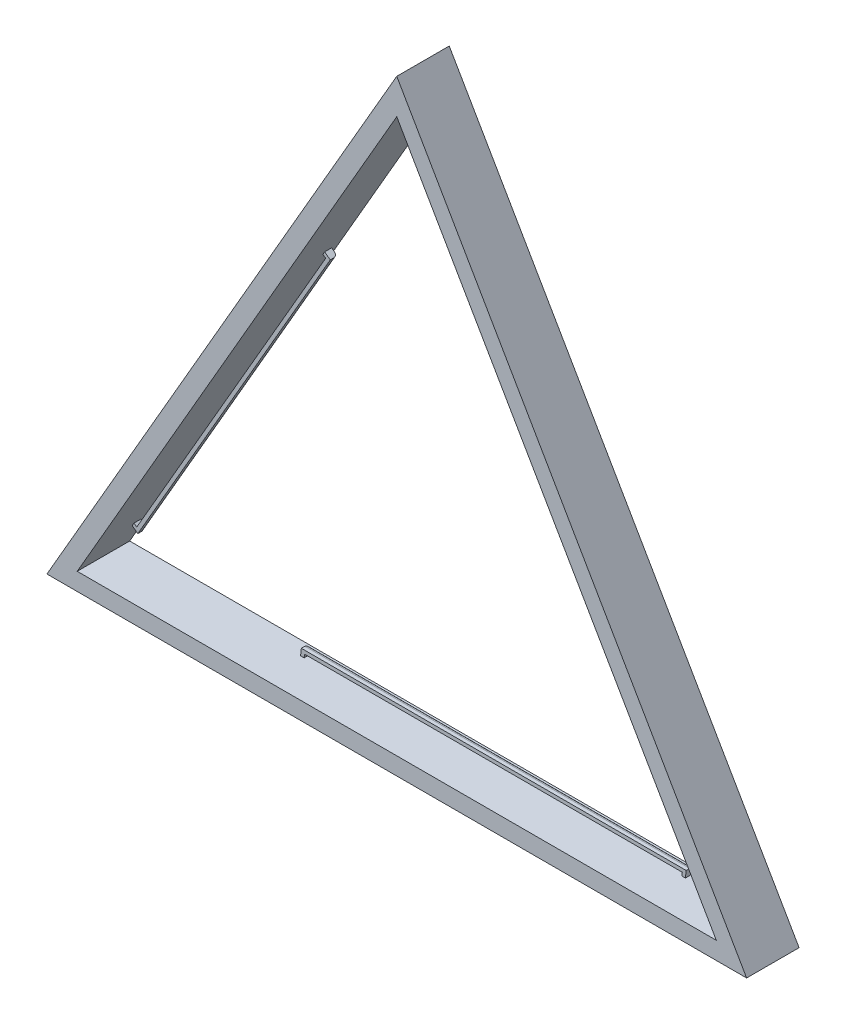
ISO-10303-21;
HEADER;
FILE_DESCRIPTION(('STEP AP214'),'2;1');
FILE_NAME('part.step','',(''),(''),'','','');
FILE_SCHEMA(('AUTOMOTIVE_DESIGN { 1 0 10303 214 1 1 1 1 }'));
ENDSEC;
DATA;
#1=APPLICATION_CONTEXT('core data for automotive mechanical design processes');
#2=APPLICATION_PROTOCOL_DEFINITION('international standard','automotive_design',2000,#1);
#3=PRODUCT_CONTEXT('',#1,'mechanical');
#4=PRODUCT('Part','Part','',(#3));
#5=PRODUCT_RELATED_PRODUCT_CATEGORY('part','',(#4));
#6=PRODUCT_DEFINITION_FORMATION('','',#4);
#7=PRODUCT_DEFINITION_CONTEXT('part definition',#1,'design');
#8=PRODUCT_DEFINITION('design','',#6,#7);
#9=PRODUCT_DEFINITION_SHAPE('','',#8);
#10=(LENGTH_UNIT() NAMED_UNIT(*) SI_UNIT(.MILLI.,.METRE.));
#11=(NAMED_UNIT(*) PLANE_ANGLE_UNIT() SI_UNIT($,.RADIAN.));
#12=(NAMED_UNIT(*) SI_UNIT($,.STERADIAN.) SOLID_ANGLE_UNIT());
#13=UNCERTAINTY_MEASURE_WITH_UNIT(LENGTH_MEASURE(1.E-05),#10,'distance_accuracy_value','');
#14=(GEOMETRIC_REPRESENTATION_CONTEXT(3) GLOBAL_UNCERTAINTY_ASSIGNED_CONTEXT((#13)) GLOBAL_UNIT_ASSIGNED_CONTEXT((#10,
#11,#12)) REPRESENTATION_CONTEXT('',''));
#15=CARTESIAN_POINT('',(0.,0.,0.));
#16=DIRECTION('',(0.,0.,1.));
#17=DIRECTION('',(1.,0.,0.));
#18=AXIS2_PLACEMENT_3D('',#15,#16,#17);
#19=CARTESIAN_POINT('',(-138.215521849513,-75.8736084303189,15.));
#20=DIRECTION('',(0.,1.,0.));
#21=DIRECTION('',(0.,0.,1.));
#22=AXIS2_PLACEMENT_3D('',#19,#20,#21);
#23=PLANE('',#22);
#24=DIRECTION('',(1.,0.,0.));
#25=VECTOR('',#24,1.);
#26=CARTESIAN_POINT('',(-138.215521849513,-75.8736084303189,2.));
#27=LINE('',#26,#25);
#28=CARTESIAN_POINT('',(23.6246344129231,-75.8736084303189,2.));
#29=VERTEX_POINT('',#28);
#30=CARTESIAN_POINT('',(24.6304207707852,-75.8736084303189,2.));
#31=VERTEX_POINT('',#30);
#32=EDGE_CURVE('E279',#29,#31,#27,.T.);
#33=ORIENTED_EDGE('',*,*,#32,.T.);
#34=DIRECTION('',(0.,0.,1.));
#35=VECTOR('',#34,1.);
#36=CARTESIAN_POINT('',(24.6304207707851,-75.8736084303189,15.));
#37=LINE('',#36,#35);
#38=CARTESIAN_POINT('',(24.6304207707852,-75.8736084303189,4.));
#39=VERTEX_POINT('',#38);
#40=EDGE_CURVE('E389',#31,#39,#37,.T.);
#41=ORIENTED_EDGE('',*,*,#40,.T.);
#42=DIRECTION('',(1.,0.,0.));
#43=VECTOR('',#42,1.);
#44=CARTESIAN_POINT('',(-138.215521849513,-75.8736084303189,4.));
#45=LINE('',#44,#43);
#46=CARTESIAN_POINT('',(23.6246344129231,-75.8736084303189,4.));
#47=VERTEX_POINT('',#46);
#48=EDGE_CURVE('E386',#47,#39,#45,.T.);
#49=ORIENTED_EDGE('',*,*,#48,.F.);
#50=DIRECTION('',(0.,0.,-1.));
#51=VECTOR('',#50,1.);
#52=CARTESIAN_POINT('',(23.6246344129231,-75.8736084303189,4.));
#53=LINE('',#52,#51);
#54=EDGE_CURVE('E921',#47,#29,#53,.T.);
#55=ORIENTED_EDGE('',*,*,#54,.T.);
#56=EDGE_LOOP('',(#33,#41,#49,#55));
#57=FACE_BOUND('',#56,.T.);
#58=DIRECTION('',(1.,0.,0.));
#59=VECTOR('',#58,1.);
#60=CARTESIAN_POINT('',(-138.215521849513,-75.8736084303189,0.));
#61=LINE('',#60,#59);
#62=CARTESIAN_POINT('',(-138.215521849513,-75.8736084303189,0.));
#63=VERTEX_POINT('',#62);
#64=CARTESIAN_POINT('',(44.4639700747985,-75.8736084303189,0.));
#65=VERTEX_POINT('',#64);
#66=EDGE_CURVE('E278',#63,#65,#61,.T.);
#67=ORIENTED_EDGE('',*,*,#66,.F.);
#68=DIRECTION('',(0.,0.,-1.));
#69=VECTOR('',#68,1.);
#70=CARTESIAN_POINT('',(-138.215521849513,-75.8736084303189,15.));
#71=LINE('',#70,#69);
#72=CARTESIAN_POINT('',(-138.215521849513,-75.8736084303189,15.));
#73=VERTEX_POINT('',#72);
#74=EDGE_CURVE('E55',#73,#63,#71,.T.);
#75=ORIENTED_EDGE('',*,*,#74,.F.);
#76=DIRECTION('',(1.,0.,0.));
#77=VECTOR('',#76,1.);
#78=CARTESIAN_POINT('',(-138.215521849513,-75.8736084303189,15.));
#79=LINE('',#78,#77);
#80=CARTESIAN_POINT('',(44.4639700747985,-75.8736084303189,15.));
#81=VERTEX_POINT('',#80);
#82=EDGE_CURVE('E347',#73,#81,#79,.T.);
#83=ORIENTED_EDGE('',*,*,#82,.T.);
#84=DIRECTION('',(0.,0.,-1.));
#85=VECTOR('',#84,1.);
#86=CARTESIAN_POINT('',(44.4639700747985,-75.8736084303189,15.));
#87=LINE('',#86,#85);
#88=EDGE_CURVE('E266',#81,#65,#87,.T.);
#89=ORIENTED_EDGE('',*,*,#88,.T.);
#90=EDGE_LOOP('',(#67,#75,#83,#89));
#91=FACE_BOUND('',#90,.T.);
#92=CARTESIAN_POINT('',(-85.3695792292148,-75.8736084303189,4.));
#93=VERTEX_POINT('',#92);
#94=CARTESIAN_POINT('',(-84.3637928713528,-75.8736084303189,4.));
#95=VERTEX_POINT('',#94);
#96=EDGE_CURVE('E390',#93,#95,#45,.T.);
#97=ORIENTED_EDGE('',*,*,#96,.F.);
#98=DIRECTION('',(0.,0.,-1.));
#99=VECTOR('',#98,1.);
#100=CARTESIAN_POINT('',(-85.3695792292148,-75.8736084303189,15.));
#101=LINE('',#100,#99);
#102=CARTESIAN_POINT('',(-85.3695792292148,-75.8736084303189,2.));
#103=VERTEX_POINT('',#102);
#104=EDGE_CURVE('E392',#93,#103,#101,.T.);
#105=ORIENTED_EDGE('',*,*,#104,.T.);
#106=CARTESIAN_POINT('',(-84.3637928713528,-75.8736084303189,2.));
#107=VERTEX_POINT('',#106);
#108=EDGE_CURVE('E283',#103,#107,#27,.T.);
#109=ORIENTED_EDGE('',*,*,#108,.T.);
#110=DIRECTION('',(0.,0.,-1.));
#111=VECTOR('',#110,1.);
#112=CARTESIAN_POINT('',(-84.3637928713528,-75.8736084303189,4.));
#113=LINE('',#112,#111);
#114=EDGE_CURVE('E918',#95,#107,#113,.T.);
#115=ORIENTED_EDGE('',*,*,#114,.F.);
#116=EDGE_LOOP('',(#97,#105,#109,#115));
#117=FACE_BOUND('',#116,.T.);
#118=ADVANCED_FACE('F38',(#57,#91,#117),#23,.T.);
#119=CARTESIAN_POINT('',(44.4639700747985,-75.8736084303189,15.));
#120=DIRECTION('',(-0.866025403784439,-0.5,0.));
#121=DIRECTION('',(0.5,-0.866025403784439,0.));
#122=AXIS2_PLACEMENT_3D('',#119,#120,#121);
#123=PLANE('',#122);
#124=DIRECTION('',(-0.5,0.866025403784438,0.));
#125=VECTOR('',#124,1.);
#126=CARTESIAN_POINT('',(44.4639700747985,-75.8736084303189,2.));
#127=LINE('',#126,#125);
#128=CARTESIAN_POINT('',(-36.4561080564194,64.2840782453937,2.));
#129=VERTEX_POINT('',#128);
#130=CARTESIAN_POINT('',(-36.9590012353504,65.1551147820821,2.));
#131=VERTEX_POINT('',#130);
#132=EDGE_CURVE('E286',#129,#131,#127,.T.);
#133=ORIENTED_EDGE('',*,*,#132,.T.);
#134=DIRECTION('',(0.,0.,1.));
#135=VECTOR('',#134,1.);
#136=CARTESIAN_POINT('',(-36.9590012353504,65.155114782082,15.));
#137=LINE('',#136,#135);
#138=CARTESIAN_POINT('',(-36.9590012353504,65.1551147820821,4.));
#139=VERTEX_POINT('',#138);
#140=EDGE_CURVE('E380',#131,#139,#137,.T.);
#141=ORIENTED_EDGE('',*,*,#140,.T.);
#142=DIRECTION('',(-0.5,0.866025403784439,0.));
#143=VECTOR('',#142,1.);
#144=CARTESIAN_POINT('',(44.4639700747985,-75.8736084303189,4.));
#145=LINE('',#144,#143);
#146=CARTESIAN_POINT('',(-36.4561080564193,64.2840782453937,4.));
#147=VERTEX_POINT('',#146);
#148=EDGE_CURVE('E377',#147,#139,#145,.T.);
#149=ORIENTED_EDGE('',*,*,#148,.F.);
#150=DIRECTION('',(0.,0.,-1.));
#151=VECTOR('',#150,1.);
#152=CARTESIAN_POINT('',(-36.4561080564193,64.2840782453937,4.));
#153=LINE('',#152,#151);
#154=EDGE_CURVE('E581',#147,#129,#153,.T.);
#155=ORIENTED_EDGE('',*,*,#154,.T.);
#156=EDGE_LOOP('',(#133,#141,#149,#155));
#157=FACE_BOUND('',#156,.T.);
#158=DIRECTION('',(-0.5,0.866025403784438,0.));
#159=VECTOR('',#158,1.);
#160=CARTESIAN_POINT('',(44.4639700747985,-75.8736084303189,0.));
#161=LINE('',#160,#159);
#162=CARTESIAN_POINT('',(-46.8757758873571,82.3314723265688,0.));
#163=VERTEX_POINT('',#162);
#164=EDGE_CURVE('E261',#65,#163,#161,.T.);
#165=ORIENTED_EDGE('',*,*,#164,.F.);
#166=ORIENTED_EDGE('',*,*,#88,.F.);
#167=DIRECTION('',(-0.5,0.866025403784438,0.));
#168=VECTOR('',#167,1.);
#169=CARTESIAN_POINT('',(44.4639700747985,-75.8736084303189,15.));
#170=LINE('',#169,#168);
#171=CARTESIAN_POINT('',(-46.8757758873571,82.3314723265689,15.));
#172=VERTEX_POINT('',#171);
#173=EDGE_CURVE('E264',#81,#172,#170,.T.);
#174=ORIENTED_EDGE('',*,*,#173,.T.);
#175=DIRECTION('',(0.,0.,-1.));
#176=VECTOR('',#175,1.);
#177=CARTESIAN_POINT('',(-46.8757758873571,82.3314723265689,15.));
#178=LINE('',#177,#176);
#179=EDGE_CURVE('E256',#172,#163,#178,.T.);
#180=ORIENTED_EDGE('',*,*,#179,.T.);
#181=EDGE_LOOP('',(#165,#166,#174,#180));
#182=FACE_BOUND('',#181,.T.);
#183=CARTESIAN_POINT('',(18.0409987646496,-30.1076796342061,4.));
#184=VERTEX_POINT('',#183);
#185=CARTESIAN_POINT('',(17.5381055857186,-29.2366430975178,4.));
#186=VERTEX_POINT('',#185);
#187=EDGE_CURVE('E381',#184,#186,#145,.T.);
#188=ORIENTED_EDGE('',*,*,#187,.F.);
#189=DIRECTION('',(0.,0.,-1.));
#190=VECTOR('',#189,1.);
#191=CARTESIAN_POINT('',(18.0409987646496,-30.1076796342061,15.));
#192=LINE('',#191,#190);
#193=CARTESIAN_POINT('',(18.0409987646496,-30.1076796342061,2.));
#194=VERTEX_POINT('',#193);
#195=EDGE_CURVE('E383',#184,#194,#192,.T.);
#196=ORIENTED_EDGE('',*,*,#195,.T.);
#197=CARTESIAN_POINT('',(17.5381055857186,-29.2366430975178,2.));
#198=VERTEX_POINT('',#197);
#199=EDGE_CURVE('E280',#194,#198,#127,.T.);
#200=ORIENTED_EDGE('',*,*,#199,.T.);
#201=DIRECTION('',(0.,0.,-1.));
#202=VECTOR('',#201,1.);
#203=CARTESIAN_POINT('',(17.5381055857186,-29.2366430975178,4.));
#204=LINE('',#203,#202);
#205=EDGE_CURVE('E584',#186,#198,#204,.T.);
#206=ORIENTED_EDGE('',*,*,#205,.F.);
#207=EDGE_LOOP('',(#188,#196,#200,#206));
#208=FACE_BOUND('',#207,.T.);
#209=ADVANCED_FACE('F257',(#157,#182,#208),#123,.T.);
#210=CARTESIAN_POINT('',(-46.8757758873571,82.3314723265689,15.));
#211=DIRECTION('',(0.866025403784439,-0.5,0.));
#212=DIRECTION('',(0.5,0.866025403784439,0.));
#213=AXIS2_PLACEMENT_3D('',#210,#211,#212);
#214=PLANE('',#213);
#215=DIRECTION('',(-0.5,-0.866025403784439,0.));
#216=VECTOR('',#215,1.);
#217=CARTESIAN_POINT('',(-46.8757758873571,82.3314723265689,2.));
#218=LINE('',#217,#216);
#219=CARTESIAN_POINT('',(-132.992006441282,-66.8262143491438,2.));
#220=VERTEX_POINT('',#219);
#221=CARTESIAN_POINT('',(-133.494899620213,-67.6972508858322,2.));
#222=VERTEX_POINT('',#221);
#223=EDGE_CURVE('E294',#220,#222,#218,.T.);
#224=ORIENTED_EDGE('',*,*,#223,.T.);
#225=DIRECTION('',(0.,0.,1.));
#226=VECTOR('',#225,1.);
#227=CARTESIAN_POINT('',(-133.494899620213,-67.6972508858322,15.));
#228=LINE('',#227,#226);
#229=CARTESIAN_POINT('',(-133.494899620213,-67.6972508858322,4.));
#230=VERTEX_POINT('',#229);
#231=EDGE_CURVE('E314',#222,#230,#228,.T.);
#232=ORIENTED_EDGE('',*,*,#231,.T.);
#233=DIRECTION('',(-0.5,-0.866025403784439,0.));
#234=VECTOR('',#233,1.);
#235=CARTESIAN_POINT('',(-46.8757758873571,82.3314723265689,4.));
#236=LINE('',#235,#234);
#237=CARTESIAN_POINT('',(-132.992006441282,-66.8262143491438,4.));
#238=VERTEX_POINT('',#237);
#239=EDGE_CURVE('E374',#238,#230,#236,.T.);
#240=ORIENTED_EDGE('',*,*,#239,.F.);
#241=DIRECTION('',(0.,0.,-1.));
#242=VECTOR('',#241,1.);
#243=CARTESIAN_POINT('',(-132.992006441282,-66.8262143491438,4.));
#244=LINE('',#243,#242);
#245=EDGE_CURVE('E317',#238,#220,#244,.T.);
#246=ORIENTED_EDGE('',*,*,#245,.T.);
#247=EDGE_LOOP('',(#224,#232,#240,#246));
#248=FACE_BOUND('',#247,.T.);
#249=DIRECTION('',(-0.5,-0.866025403784439,0.));
#250=VECTOR('',#249,1.);
#251=CARTESIAN_POINT('',(-46.8757758873571,82.3314723265689,0.));
#252=LINE('',#251,#250);
#253=EDGE_CURVE('E269',#163,#63,#252,.T.);
#254=ORIENTED_EDGE('',*,*,#253,.F.);
#255=ORIENTED_EDGE('',*,*,#179,.F.);
#256=DIRECTION('',(-0.5,-0.866025403784439,0.));
#257=VECTOR('',#256,1.);
#258=CARTESIAN_POINT('',(-46.8757758873571,82.3314723265689,15.));
#259=LINE('',#258,#257);
#260=EDGE_CURVE('E350',#172,#73,#259,.T.);
#261=ORIENTED_EDGE('',*,*,#260,.T.);
#262=ORIENTED_EDGE('',*,*,#74,.T.);
#263=EDGE_LOOP('',(#254,#255,#261,#262));
#264=FACE_BOUND('',#263,.T.);
#265=CARTESIAN_POINT('',(-78.494899620213,27.5655435304555,4.));
#266=VERTEX_POINT('',#265);
#267=CARTESIAN_POINT('',(-78.9977927991441,26.694506993767,4.));
#268=VERTEX_POINT('',#267);
#269=EDGE_CURVE('E376',#266,#268,#236,.T.);
#270=ORIENTED_EDGE('',*,*,#269,.F.);
#271=DIRECTION('',(0.,0.,-1.));
#272=VECTOR('',#271,1.);
#273=CARTESIAN_POINT('',(-78.494899620213,27.5655435304555,15.));
#274=LINE('',#273,#272);
#275=CARTESIAN_POINT('',(-78.494899620213,27.5655435304555,2.));
#276=VERTEX_POINT('',#275);
#277=EDGE_CURVE('E328',#266,#276,#274,.T.);
#278=ORIENTED_EDGE('',*,*,#277,.T.);
#279=CARTESIAN_POINT('',(-78.9977927991441,26.694506993767,2.));
#280=VERTEX_POINT('',#279);
#281=EDGE_CURVE('E274',#276,#280,#218,.T.);
#282=ORIENTED_EDGE('',*,*,#281,.T.);
#283=DIRECTION('',(0.,0.,-1.));
#284=VECTOR('',#283,1.);
#285=CARTESIAN_POINT('',(-78.9977927991441,26.694506993767,4.));
#286=LINE('',#285,#284);
#287=EDGE_CURVE('E627',#268,#280,#286,.T.);
#288=ORIENTED_EDGE('',*,*,#287,.F.);
#289=EDGE_LOOP('',(#270,#278,#282,#288));
#290=FACE_BOUND('',#289,.T.);
#291=ADVANCED_FACE('F270',(#248,#264,#290),#214,.T.);
#292=CARTESIAN_POINT('',(0.,0.,15.));
#293=DIRECTION('',(0.,0.,1.));
#294=DIRECTION('',(1.,0.,0.));
#295=AXIS2_PLACEMENT_3D('',#292,#293,#294);
#296=PLANE('',#295);
#297=DIRECTION('',(-0.5,0.866025403784439,0.));
#298=VECTOR('',#297,1.);
#299=CARTESIAN_POINT('',(53.1242241126429,-80.8736084303189,15.));
#300=LINE('',#299,#298);
#301=CARTESIAN_POINT('',(53.1242241126429,-80.8736084303189,15.));
#302=VERTEX_POINT('',#301);
#303=CARTESIAN_POINT('',(-46.8757758873571,92.3314723265689,15.));
#304=VERTEX_POINT('',#303);
#305=EDGE_CURVE('E352',#302,#304,#300,.T.);
#306=ORIENTED_EDGE('',*,*,#305,.T.);
#307=DIRECTION('',(-0.5,-0.866025403784439,0.));
#308=VECTOR('',#307,1.);
#309=CARTESIAN_POINT('',(-46.8757758873571,92.3314723265689,15.));
#310=LINE('',#309,#308);
#311=CARTESIAN_POINT('',(-146.875775887357,-80.8736084303189,15.));
#312=VERTEX_POINT('',#311);
#313=EDGE_CURVE('E355',#304,#312,#310,.T.);
#314=ORIENTED_EDGE('',*,*,#313,.T.);
#315=DIRECTION('',(1.,0.,0.));
#316=VECTOR('',#315,1.);
#317=CARTESIAN_POINT('',(-146.875775887357,-80.8736084303189,15.));
#318=LINE('',#317,#316);
#319=EDGE_CURVE('E358',#312,#302,#318,.T.);
#320=ORIENTED_EDGE('',*,*,#319,.T.);
#321=EDGE_LOOP('',(#306,#314,#320));
#322=FACE_BOUND('',#321,.T.);
#323=ORIENTED_EDGE('',*,*,#173,.F.);
#324=ORIENTED_EDGE('',*,*,#82,.F.);
#325=ORIENTED_EDGE('',*,*,#260,.F.);
#326=EDGE_LOOP('',(#323,#324,#325));
#327=FACE_BOUND('',#326,.T.);
#328=ADVANCED_FACE('F424',(#322,#327),#296,.T.);
#329=CARTESIAN_POINT('',(0.,0.,0.));
#330=DIRECTION('',(0.,0.,1.));
#331=DIRECTION('',(1.,0.,0.));
#332=AXIS2_PLACEMENT_3D('',#329,#330,#331);
#333=PLANE('',#332);
#334=ORIENTED_EDGE('',*,*,#66,.T.);
#335=ORIENTED_EDGE('',*,*,#164,.T.);
#336=ORIENTED_EDGE('',*,*,#253,.T.);
#337=EDGE_LOOP('',(#334,#335,#336));
#338=FACE_BOUND('',#337,.T.);
#339=DIRECTION('',(-0.5,0.866025403784439,0.));
#340=VECTOR('',#339,1.);
#341=CARTESIAN_POINT('',(53.1242241126429,-80.8736084303189,0.));
#342=LINE('',#341,#340);
#343=CARTESIAN_POINT('',(53.1242241126429,-80.8736084303189,0.));
#344=VERTEX_POINT('',#343);
#345=CARTESIAN_POINT('',(-46.8757758873571,92.3314723265689,0.));
#346=VERTEX_POINT('',#345);
#347=EDGE_CURVE('E361',#344,#346,#342,.T.);
#348=ORIENTED_EDGE('',*,*,#347,.F.);
#349=DIRECTION('',(1.,0.,0.));
#350=VECTOR('',#349,1.);
#351=CARTESIAN_POINT('',(-146.875775887357,-80.8736084303189,0.));
#352=LINE('',#351,#350);
#353=CARTESIAN_POINT('',(-146.875775887357,-80.8736084303189,0.));
#354=VERTEX_POINT('',#353);
#355=EDGE_CURVE('E356',#354,#344,#352,.T.);
#356=ORIENTED_EDGE('',*,*,#355,.F.);
#357=DIRECTION('',(-0.5,-0.866025403784439,0.));
#358=VECTOR('',#357,1.);
#359=CARTESIAN_POINT('',(-46.8757758873571,92.3314723265689,0.));
#360=LINE('',#359,#358);
#361=EDGE_CURVE('E364',#346,#354,#360,.T.);
#362=ORIENTED_EDGE('',*,*,#361,.F.);
#363=EDGE_LOOP('',(#348,#356,#362));
#364=FACE_BOUND('',#363,.T.);
#365=ADVANCED_FACE('F276',(#338,#364),#333,.F.);
#366=CARTESIAN_POINT('',(53.1242241126429,-80.8736084303189,15.));
#367=DIRECTION('',(-0.866025403784439,-0.5,0.));
#368=DIRECTION('',(0.5,-0.866025403784439,0.));
#369=AXIS2_PLACEMENT_3D('',#366,#367,#368);
#370=PLANE('',#369);
#371=ORIENTED_EDGE('',*,*,#347,.T.);
#372=DIRECTION('',(0.,0.,-1.));
#373=VECTOR('',#372,1.);
#374=CARTESIAN_POINT('',(-46.8757758873571,92.3314723265689,15.));
#375=LINE('',#374,#373);
#376=EDGE_CURVE('E372',#304,#346,#375,.T.);
#377=ORIENTED_EDGE('',*,*,#376,.F.);
#378=ORIENTED_EDGE('',*,*,#305,.F.);
#379=DIRECTION('',(0.,0.,-1.));
#380=VECTOR('',#379,1.);
#381=CARTESIAN_POINT('',(53.1242241126429,-80.8736084303189,15.));
#382=LINE('',#381,#380);
#383=EDGE_CURVE('E360',#302,#344,#382,.T.);
#384=ORIENTED_EDGE('',*,*,#383,.T.);
#385=EDGE_LOOP('',(#371,#377,#378,#384));
#386=FACE_BOUND('',#385,.T.);
#387=ADVANCED_FACE('F432',(#386),#370,.F.);
#388=CARTESIAN_POINT('',(-46.8757758873571,92.3314723265689,15.));
#389=DIRECTION('',(0.866025403784439,-0.5,0.));
#390=DIRECTION('',(0.5,0.866025403784439,0.));
#391=AXIS2_PLACEMENT_3D('',#388,#389,#390);
#392=PLANE('',#391);
#393=ORIENTED_EDGE('',*,*,#361,.T.);
#394=DIRECTION('',(0.,0.,-1.));
#395=VECTOR('',#394,1.);
#396=CARTESIAN_POINT('',(-146.875775887357,-80.8736084303189,15.));
#397=LINE('',#396,#395);
#398=EDGE_CURVE('E370',#312,#354,#397,.T.);
#399=ORIENTED_EDGE('',*,*,#398,.F.);
#400=ORIENTED_EDGE('',*,*,#313,.F.);
#401=ORIENTED_EDGE('',*,*,#376,.T.);
#402=EDGE_LOOP('',(#393,#399,#400,#401));
#403=FACE_BOUND('',#402,.T.);
#404=ADVANCED_FACE('F666',(#403),#392,.F.);
#405=CARTESIAN_POINT('',(-146.875775887357,-80.8736084303189,15.));
#406=DIRECTION('',(0.,1.,0.));
#407=DIRECTION('',(0.,0.,1.));
#408=AXIS2_PLACEMENT_3D('',#405,#406,#407);
#409=PLANE('',#408);
#410=ORIENTED_EDGE('',*,*,#355,.T.);
#411=ORIENTED_EDGE('',*,*,#383,.F.);
#412=ORIENTED_EDGE('',*,*,#319,.F.);
#413=ORIENTED_EDGE('',*,*,#398,.T.);
#414=EDGE_LOOP('',(#410,#411,#412,#413));
#415=FACE_BOUND('',#414,.T.);
#416=ADVANCED_FACE('F458',(#415),#409,.F.);
#417=CARTESIAN_POINT('',(0.,0.,4.));
#418=DIRECTION('',(0.,0.,1.));
#419=DIRECTION('',(1.,0.,0.));
#420=AXIS2_PLACEMENT_3D('',#417,#418,#419);
#421=PLANE('',#420);
#422=DIRECTION('',(-0.807486963136154,0.589885416301464,0.));
#423=VECTOR('',#422,1.);
#424=CARTESIAN_POINT('',(-76.8845981024782,26.3891859859688,4.));
#425=LINE('',#424,#423);
#426=CARTESIAN_POINT('',(-76.8845981024782,26.3891859859688,4.));
#427=VERTEX_POINT('',#426);
#428=EDGE_CURVE('E634',#427,#266,#425,.T.);
#429=ORIENTED_EDGE('',*,*,#428,.T.);
#430=ORIENTED_EDGE('',*,*,#269,.T.);
#431=DIRECTION('',(-0.807486963136217,0.589885416301378,0.));
#432=VECTOR('',#431,1.);
#433=CARTESIAN_POINT('',(-78.1996506530831,26.1114481536982,4.));
#434=LINE('',#433,#432);
#435=CARTESIAN_POINT('',(-78.1996506530831,26.1114481536982,4.));
#436=VERTEX_POINT('',#435);
#437=EDGE_CURVE('E613',#436,#268,#434,.T.);
#438=ORIENTED_EDGE('',*,*,#437,.F.);
#439=DIRECTION('',(0.5,0.866025403784439,0.));
#440=VECTOR('',#439,1.);
#441=CARTESIAN_POINT('',(-78.1996506530831,26.1114481536982,4.));
#442=LINE('',#441,#440);
#443=CARTESIAN_POINT('',(-132.193864295221,-67.4092731892126,4.));
#444=VERTEX_POINT('',#443);
#445=EDGE_CURVE('E611',#444,#436,#442,.T.);
#446=ORIENTED_EDGE('',*,*,#445,.F.);
#447=DIRECTION('',(0.80748696313622,-0.589885416301374,0.));
#448=VECTOR('',#447,1.);
#449=CARTESIAN_POINT('',(-132.992006441282,-66.8262143491438,4.));
#450=LINE('',#449,#448);
#451=EDGE_CURVE('E617',#238,#444,#450,.T.);
#452=ORIENTED_EDGE('',*,*,#451,.F.);
#453=ORIENTED_EDGE('',*,*,#239,.T.);
#454=DIRECTION('',(0.80748696313616,-0.589885416301456,0.));
#455=VECTOR('',#454,1.);
#456=CARTESIAN_POINT('',(-134.307058991886,-67.1039521814144,4.));
#457=LINE('',#456,#455);
#458=CARTESIAN_POINT('',(-131.884598102478,-68.8736084303189,4.));
#459=VERTEX_POINT('',#458);
#460=EDGE_CURVE('E327',#230,#459,#457,.T.);
#461=ORIENTED_EDGE('',*,*,#460,.T.);
#462=DIRECTION('',(0.5,0.866025403784439,0.));
#463=VECTOR('',#462,1.);
#464=CARTESIAN_POINT('',(-76.8845981024782,26.3891859859688,4.));
#465=LINE('',#464,#463);
#466=EDGE_CURVE('E638',#459,#427,#465,.T.);
#467=ORIENTED_EDGE('',*,*,#466,.T.);
#468=EDGE_LOOP('',(#429,#430,#438,#446,#452,#453,#461,#467));
#469=FACE_BOUND('',#468,.T.);
#470=ADVANCED_FACE('F447',(#469),#421,.T.);
#471=CARTESIAN_POINT('',(-76.8845981024782,26.3891859859688,4.));
#472=DIRECTION('',(-0.589885416301464,-0.807486963136154,0.));
#473=DIRECTION('',(0.807486963136154,-0.589885416301464,0.));
#474=AXIS2_PLACEMENT_3D('',#471,#472,#473);
#475=PLANE('',#474);
#476=DIRECTION('',(0.,0.,-1.));
#477=VECTOR('',#476,1.);
#478=CARTESIAN_POINT('',(-76.8845981024782,26.3891859859688,4.));
#479=LINE('',#478,#477);
#480=CARTESIAN_POINT('',(-76.8845981024782,26.3891859859688,2.99985104881701));
#481=VERTEX_POINT('',#480);
#482=EDGE_CURVE('E335',#427,#481,#479,.T.);
#483=ORIENTED_EDGE('',*,*,#482,.T.);
#484=CARTESIAN_POINT('',(-77.696757474152,26.9824846903866,2.99985104881701));
#485=DIRECTION('',(-0.589885416301464,-0.807486963136154,0.));
#486=DIRECTION('',(0.807486963136154,-0.589885416301464,0.));
#487=AXIS2_PLACEMENT_3D('',#484,#485,#486);
#488=ELLIPSE('',#487,1.00578635786204,1.);
#489=CARTESIAN_POINT('',(-77.6827402485392,26.9722448260378,2.));
#490=VERTEX_POINT('',#489);
#491=EDGE_CURVE('E406',#481,#490,#488,.F.);
#492=ORIENTED_EDGE('',*,*,#491,.T.);
#493=DIRECTION('',(-0.807486963136154,0.589885416301464,0.));
#494=VECTOR('',#493,1.);
#495=CARTESIAN_POINT('',(-76.8845981024782,26.3891859859688,2.));
#496=LINE('',#495,#494);
#497=EDGE_CURVE('E633',#490,#276,#496,.T.);
#498=ORIENTED_EDGE('',*,*,#497,.T.);
#499=ORIENTED_EDGE('',*,*,#277,.F.);
#500=ORIENTED_EDGE('',*,*,#428,.F.);
#501=EDGE_LOOP('',(#483,#492,#498,#499,#500));
#502=FACE_BOUND('',#501,.T.);
#503=ADVANCED_FACE('F444',(#502),#475,.F.);
#504=CARTESIAN_POINT('',(-134.307058991886,-67.1039521814144,4.));
#505=DIRECTION('',(0.589885416301456,0.80748696313616,0.));
#506=DIRECTION('',(-0.80748696313616,0.589885416301456,0.));
#507=AXIS2_PLACEMENT_3D('',#504,#505,#506);
#508=PLANE('',#507);
#509=DIRECTION('',(0.80748696313616,-0.589885416301456,0.));
#510=VECTOR('',#509,1.);
#511=CARTESIAN_POINT('',(-134.307058991886,-67.1039521814144,2.));
#512=LINE('',#511,#510);
#513=CARTESIAN_POINT('',(-132.682740248539,-68.2905495902499,2.));
#514=VERTEX_POINT('',#513);
#515=EDGE_CURVE('E324',#222,#514,#512,.T.);
#516=ORIENTED_EDGE('',*,*,#515,.T.);
#517=CARTESIAN_POINT('',(-132.696757474152,-68.2803097259011,2.99985104881701));
#518=DIRECTION('',(0.589885416301456,0.80748696313616,0.));
#519=DIRECTION('',(0.80748696313616,-0.589885416301456,0.));
#520=AXIS2_PLACEMENT_3D('',#517,#518,#519);
#521=ELLIPSE('',#520,1.00578635786204,1.);
#522=CARTESIAN_POINT('',(-131.884598102478,-68.8736084303189,2.99985104881701));
#523=VERTEX_POINT('',#522);
#524=EDGE_CURVE('E409',#514,#523,#521,.F.);
#525=ORIENTED_EDGE('',*,*,#524,.T.);
#526=DIRECTION('',(0.,0.,-1.));
#527=VECTOR('',#526,1.);
#528=CARTESIAN_POINT('',(-131.884598102478,-68.8736084303189,4.));
#529=LINE('',#528,#527);
#530=EDGE_CURVE('E329',#459,#523,#529,.T.);
#531=ORIENTED_EDGE('',*,*,#530,.F.);
#532=ORIENTED_EDGE('',*,*,#460,.F.);
#533=ORIENTED_EDGE('',*,*,#231,.F.);
#534=EDGE_LOOP('',(#516,#525,#531,#532,#533));
#535=FACE_BOUND('',#534,.T.);
#536=ADVANCED_FACE('F323',(#535),#508,.F.);
#537=CARTESIAN_POINT('',(-76.8845981024782,26.3891859859688,4.));
#538=DIRECTION('',(-0.866025403784439,0.5,0.));
#539=DIRECTION('',(-0.5,-0.866025403784439,0.));
#540=AXIS2_PLACEMENT_3D('',#537,#538,#539);
#541=PLANE('',#540);
#542=ORIENTED_EDGE('',*,*,#530,.T.);
#543=DIRECTION('',(-0.5,-0.866025403784439,0.));
#544=VECTOR('',#543,1.);
#545=CARTESIAN_POINT('',(-76.8845981024782,26.3891859859688,2.99985104881701));
#546=LINE('',#545,#544);
#547=EDGE_CURVE('E403',#523,#481,#546,.F.);
#548=ORIENTED_EDGE('',*,*,#547,.T.);
#549=ORIENTED_EDGE('',*,*,#482,.F.);
#550=ORIENTED_EDGE('',*,*,#466,.F.);
#551=EDGE_LOOP('',(#542,#548,#549,#550));
#552=FACE_BOUND('',#551,.T.);
#553=ADVANCED_FACE('F451',(#552),#541,.F.);
#554=CARTESIAN_POINT('',(-78.1996506530831,26.1114481536982,4.));
#555=DIRECTION('',(-0.866025403784439,0.5,0.));
#556=DIRECTION('',(-0.5,-0.866025403784439,0.));
#557=AXIS2_PLACEMENT_3D('',#554,#555,#556);
#558=PLANE('',#557);
#559=DIRECTION('',(0.5,0.866025403784439,0.));
#560=VECTOR('',#559,1.);
#561=CARTESIAN_POINT('',(-78.1996506530831,26.1114481536982,2.));
#562=LINE('',#561,#560);
#563=CARTESIAN_POINT('',(-132.193864295221,-67.4092731892126,2.));
#564=VERTEX_POINT('',#563);
#565=CARTESIAN_POINT('',(-78.1996506530831,26.1114481536982,2.));
#566=VERTEX_POINT('',#565);
#567=EDGE_CURVE('E610',#564,#566,#562,.T.);
#568=ORIENTED_EDGE('',*,*,#567,.F.);
#569=DIRECTION('',(0.,0.,-1.));
#570=VECTOR('',#569,1.);
#571=CARTESIAN_POINT('',(-132.193864295221,-67.4092731892126,4.));
#572=LINE('',#571,#570);
#573=EDGE_CURVE('E619',#444,#564,#572,.T.);
#574=ORIENTED_EDGE('',*,*,#573,.F.);
#575=ORIENTED_EDGE('',*,*,#445,.T.);
#576=DIRECTION('',(0.,0.,-1.));
#577=VECTOR('',#576,1.);
#578=CARTESIAN_POINT('',(-78.1996506530831,26.1114481536982,4.));
#579=LINE('',#578,#577);
#580=EDGE_CURVE('E630',#436,#566,#579,.T.);
#581=ORIENTED_EDGE('',*,*,#580,.T.);
#582=EDGE_LOOP('',(#568,#574,#575,#581));
#583=FACE_BOUND('',#582,.T.);
#584=ADVANCED_FACE('F454',(#583),#558,.T.);
#585=CARTESIAN_POINT('',(-78.1996506530831,26.1114481536982,4.));
#586=DIRECTION('',(-0.589885416301378,-0.807486963136217,0.));
#587=DIRECTION('',(0.807486963136217,-0.589885416301378,0.));
#588=AXIS2_PLACEMENT_3D('',#585,#586,#587);
#589=PLANE('',#588);
#590=DIRECTION('',(-0.807486963136217,0.589885416301378,0.));
#591=VECTOR('',#590,1.);
#592=CARTESIAN_POINT('',(-78.1996506530831,26.1114481536982,2.));
#593=LINE('',#592,#591);
#594=EDGE_CURVE('E621',#566,#280,#593,.T.);
#595=ORIENTED_EDGE('',*,*,#594,.F.);
#596=ORIENTED_EDGE('',*,*,#580,.F.);
#597=ORIENTED_EDGE('',*,*,#437,.T.);
#598=ORIENTED_EDGE('',*,*,#287,.T.);
#599=EDGE_LOOP('',(#595,#596,#597,#598));
#600=FACE_BOUND('',#599,.T.);
#601=ADVANCED_FACE('F462',(#600),#589,.T.);
#602=CARTESIAN_POINT('',(-132.992006441282,-66.8262143491438,4.));
#603=DIRECTION('',(0.589885416301374,0.80748696313622,0.));
#604=DIRECTION('',(-0.80748696313622,0.589885416301374,0.));
#605=AXIS2_PLACEMENT_3D('',#602,#603,#604);
#606=PLANE('',#605);
#607=DIRECTION('',(0.80748696313622,-0.589885416301374,0.));
#608=VECTOR('',#607,1.);
#609=CARTESIAN_POINT('',(-132.992006441282,-66.8262143491438,2.));
#610=LINE('',#609,#608);
#611=EDGE_CURVE('E614',#220,#564,#610,.T.);
#612=ORIENTED_EDGE('',*,*,#611,.F.);
#613=ORIENTED_EDGE('',*,*,#245,.F.);
#614=ORIENTED_EDGE('',*,*,#451,.T.);
#615=ORIENTED_EDGE('',*,*,#573,.T.);
#616=EDGE_LOOP('',(#612,#613,#614,#615));
#617=FACE_BOUND('',#616,.T.);
#618=ADVANCED_FACE('F466',(#617),#606,.T.);
#619=CARTESIAN_POINT('',(0.,0.,4.));
#620=DIRECTION('',(0.,0.,1.));
#621=DIRECTION('',(1.,0.,0.));
#622=AXIS2_PLACEMENT_3D('',#619,#620,#621);
#623=PLANE('',#622);
#624=DIRECTION('',(0.914599237407135,0.404361515149856,0.));
#625=VECTOR('',#624,1.);
#626=CARTESIAN_POINT('',(16.2170924883232,-30.9140628840736,4.));
#627=LINE('',#626,#625);
#628=CARTESIAN_POINT('',(16.2170924883232,-30.9140628840736,4.));
#629=VERTEX_POINT('',#628);
#630=EDGE_CURVE('E594',#629,#184,#627,.T.);
#631=ORIENTED_EDGE('',*,*,#630,.T.);
#632=ORIENTED_EDGE('',*,*,#187,.T.);
#633=DIRECTION('',(0.914599237407154,0.404361515149813,0.));
#634=VECTOR('',#633,1.);
#635=CARTESIAN_POINT('',(16.6340907452873,-29.6363250518031,4.));
#636=LINE('',#635,#634);
#637=CARTESIAN_POINT('',(16.6340907452873,-29.6363250518031,4.));
#638=VERTEX_POINT('',#637);
#639=EDGE_CURVE('E568',#638,#186,#636,.T.);
#640=ORIENTED_EDGE('',*,*,#639,.F.);
#641=DIRECTION('',(0.5,-0.866025403784439,0.));
#642=VECTOR('',#641,1.);
#643=CARTESIAN_POINT('',(16.6340907452873,-29.6363250518031,4.));
#644=LINE('',#643,#642);
#645=CARTESIAN_POINT('',(-37.3601228968505,63.8843962911084,4.));
#646=VERTEX_POINT('',#645);
#647=EDGE_CURVE('E566',#646,#638,#644,.T.);
#648=ORIENTED_EDGE('',*,*,#647,.F.);
#649=DIRECTION('',(-0.914599237407138,-0.404361515149849,0.));
#650=VECTOR('',#649,1.);
#651=CARTESIAN_POINT('',(-36.4561080564193,64.2840782453937,4.));
#652=LINE('',#651,#650);
#653=EDGE_CURVE('E572',#147,#646,#652,.T.);
#654=ORIENTED_EDGE('',*,*,#653,.F.);
#655=ORIENTED_EDGE('',*,*,#148,.T.);
#656=DIRECTION('',(-0.914599237407126,-0.404361515149876,0.));
#657=VECTOR('',#656,1.);
#658=CARTESIAN_POINT('',(-36.0391097994552,65.5618160776643,4.));
#659=LINE('',#658,#657);
#660=CARTESIAN_POINT('',(-38.7829075116767,64.3487315322146,4.));
#661=VERTEX_POINT('',#660);
#662=EDGE_CURVE('E598',#139,#661,#659,.T.);
#663=ORIENTED_EDGE('',*,*,#662,.T.);
#664=DIRECTION('',(0.5,-0.866025403784439,0.));
#665=VECTOR('',#664,1.);
#666=CARTESIAN_POINT('',(16.2170924883232,-30.9140628840736,4.));
#667=LINE('',#666,#665);
#668=EDGE_CURVE('E591',#661,#629,#667,.T.);
#669=ORIENTED_EDGE('',*,*,#668,.T.);
#670=EDGE_LOOP('',(#631,#632,#640,#648,#654,#655,#663,#669));
#671=FACE_BOUND('',#670,.T.);
#672=ADVANCED_FACE('F470',(#671),#623,.T.);
#673=CARTESIAN_POINT('',(16.2170924883232,-30.9140628840736,4.));
#674=DIRECTION('',(0.866025403784439,0.5,0.));
#675=DIRECTION('',(-0.5,0.866025403784439,0.));
#676=AXIS2_PLACEMENT_3D('',#673,#674,#675);
#677=PLANE('',#676);
#678=DIRECTION('',(0.,0.,-1.));
#679=VECTOR('',#678,1.);
#680=CARTESIAN_POINT('',(-38.7829075116767,64.3487315322146,4.));
#681=LINE('',#680,#679);
#682=CARTESIAN_POINT('',(-38.7829075116767,64.3487315322146,2.99985104881701));
#683=VERTEX_POINT('',#682);
#684=EDGE_CURVE('E600',#661,#683,#681,.T.);
#685=ORIENTED_EDGE('',*,*,#684,.T.);
#686=DIRECTION('',(-0.5,0.866025403784439,0.));
#687=VECTOR('',#686,1.);
#688=CARTESIAN_POINT('',(16.2170924883232,-30.9140628840736,2.99985104881701));
#689=LINE('',#688,#687);
#690=CARTESIAN_POINT('',(16.2170924883232,-30.9140628840736,2.99985104881701));
#691=VERTEX_POINT('',#690);
#692=EDGE_CURVE('E395',#683,#691,#689,.F.);
#693=ORIENTED_EDGE('',*,*,#692,.T.);
#694=DIRECTION('',(0.,0.,-1.));
#695=VECTOR('',#694,1.);
#696=CARTESIAN_POINT('',(16.2170924883232,-30.9140628840736,4.));
#697=LINE('',#696,#695);
#698=EDGE_CURVE('E607',#629,#691,#697,.T.);
#699=ORIENTED_EDGE('',*,*,#698,.F.);
#700=ORIENTED_EDGE('',*,*,#668,.F.);
#701=EDGE_LOOP('',(#685,#693,#699,#700));
#702=FACE_BOUND('',#701,.T.);
#703=ADVANCED_FACE('F472',(#702),#677,.F.);
#704=CARTESIAN_POINT('',(16.2170924883232,-30.9140628840736,4.));
#705=DIRECTION('',(-0.404361515149856,0.914599237407135,0.));
#706=DIRECTION('',(-0.914599237407135,-0.404361515149856,0.));
#707=AXIS2_PLACEMENT_3D('',#704,#705,#706);
#708=PLANE('',#707);
#709=ORIENTED_EDGE('',*,*,#698,.T.);
#710=CARTESIAN_POINT('',(17.1369839242184,-30.5073615884914,2.99985104881701));
#711=DIRECTION('',(-0.404361515149856,0.914599237407135,0.));
#712=DIRECTION('',(-0.914599237407135,-0.404361515149856,0.));
#713=AXIS2_PLACEMENT_3D('',#710,#711,#712);
#714=ELLIPSE('',#713,1.00578635786205,1.);
#715=CARTESIAN_POINT('',(17.1211073287545,-30.5143809297883,2.));
#716=VERTEX_POINT('',#715);
#717=EDGE_CURVE('E398',#691,#716,#714,.F.);
#718=ORIENTED_EDGE('',*,*,#717,.T.);
#719=DIRECTION('',(0.914599237407135,0.404361515149856,0.));
#720=VECTOR('',#719,1.);
#721=CARTESIAN_POINT('',(16.2170924883232,-30.9140628840736,2.));
#722=LINE('',#721,#720);
#723=EDGE_CURVE('E590',#716,#194,#722,.T.);
#724=ORIENTED_EDGE('',*,*,#723,.T.);
#725=ORIENTED_EDGE('',*,*,#195,.F.);
#726=ORIENTED_EDGE('',*,*,#630,.F.);
#727=EDGE_LOOP('',(#709,#718,#724,#725,#726));
#728=FACE_BOUND('',#727,.T.);
#729=ADVANCED_FACE('F475',(#728),#708,.F.);
#730=CARTESIAN_POINT('',(-36.0391097994552,65.5618160776643,4.));
#731=DIRECTION('',(0.404361515149876,-0.914599237407126,0.));
#732=DIRECTION('',(0.914599237407126,0.404361515149876,0.));
#733=AXIS2_PLACEMENT_3D('',#730,#731,#732);
#734=PLANE('',#733);
#735=DIRECTION('',(-0.914599237407126,-0.404361515149876,0.));
#736=VECTOR('',#735,1.);
#737=CARTESIAN_POINT('',(-36.0391097994552,65.5618160776643,2.));
#738=LINE('',#737,#736);
#739=CARTESIAN_POINT('',(-37.8788926712455,64.7484134864999,2.));
#740=VERTEX_POINT('',#739);
#741=EDGE_CURVE('E595',#131,#740,#738,.T.);
#742=ORIENTED_EDGE('',*,*,#741,.T.);
#743=CARTESIAN_POINT('',(-37.8630160757816,64.7554328277968,2.99985104881701));
#744=DIRECTION('',(0.404361515149876,-0.914599237407126,0.));
#745=DIRECTION('',(-0.914599237407126,-0.404361515149876,0.));
#746=AXIS2_PLACEMENT_3D('',#743,#744,#745);
#747=ELLIPSE('',#746,1.00578635786204,1.);
#748=EDGE_CURVE('E401',#740,#683,#747,.F.);
#749=ORIENTED_EDGE('',*,*,#748,.T.);
#750=ORIENTED_EDGE('',*,*,#684,.F.);
#751=ORIENTED_EDGE('',*,*,#662,.F.);
#752=ORIENTED_EDGE('',*,*,#140,.F.);
#753=EDGE_LOOP('',(#742,#749,#750,#751,#752));
#754=FACE_BOUND('',#753,.T.);
#755=ADVANCED_FACE('F479',(#754),#734,.F.);
#756=CARTESIAN_POINT('',(16.6340907452873,-29.6363250518031,4.));
#757=DIRECTION('',(0.866025403784439,0.5,0.));
#758=DIRECTION('',(-0.5,0.866025403784439,0.));
#759=AXIS2_PLACEMENT_3D('',#756,#757,#758);
#760=PLANE('',#759);
#761=DIRECTION('',(0.5,-0.866025403784439,0.));
#762=VECTOR('',#761,1.);
#763=CARTESIAN_POINT('',(16.6340907452873,-29.6363250518031,2.));
#764=LINE('',#763,#762);
#765=CARTESIAN_POINT('',(-37.3601228968505,63.8843962911084,2.));
#766=VERTEX_POINT('',#765);
#767=CARTESIAN_POINT('',(16.6340907452873,-29.6363250518031,2.));
#768=VERTEX_POINT('',#767);
#769=EDGE_CURVE('E560',#766,#768,#764,.T.);
#770=ORIENTED_EDGE('',*,*,#769,.F.);
#771=DIRECTION('',(0.,0.,-1.));
#772=VECTOR('',#771,1.);
#773=CARTESIAN_POINT('',(-37.3601228968505,63.8843962911084,4.));
#774=LINE('',#773,#772);
#775=EDGE_CURVE('E574',#646,#766,#774,.T.);
#776=ORIENTED_EDGE('',*,*,#775,.F.);
#777=ORIENTED_EDGE('',*,*,#647,.T.);
#778=DIRECTION('',(0.,0.,-1.));
#779=VECTOR('',#778,1.);
#780=CARTESIAN_POINT('',(16.6340907452873,-29.6363250518031,4.));
#781=LINE('',#780,#779);
#782=EDGE_CURVE('E587',#638,#768,#781,.T.);
#783=ORIENTED_EDGE('',*,*,#782,.T.);
#784=EDGE_LOOP('',(#770,#776,#777,#783));
#785=FACE_BOUND('',#784,.T.);
#786=ADVANCED_FACE('F483',(#785),#760,.T.);
#787=CARTESIAN_POINT('',(16.6340907452873,-29.6363250518031,4.));
#788=DIRECTION('',(-0.404361515149813,0.914599237407154,0.));
#789=DIRECTION('',(-0.914599237407154,-0.404361515149813,0.));
#790=AXIS2_PLACEMENT_3D('',#787,#788,#789);
#791=PLANE('',#790);
#792=DIRECTION('',(0.914599237407154,0.404361515149813,0.));
#793=VECTOR('',#792,1.);
#794=CARTESIAN_POINT('',(16.6340907452873,-29.6363250518031,2.));
#795=LINE('',#794,#793);
#796=EDGE_CURVE('E576',#768,#198,#795,.T.);
#797=ORIENTED_EDGE('',*,*,#796,.F.);
#798=ORIENTED_EDGE('',*,*,#782,.F.);
#799=ORIENTED_EDGE('',*,*,#639,.T.);
#800=ORIENTED_EDGE('',*,*,#205,.T.);
#801=EDGE_LOOP('',(#797,#798,#799,#800));
#802=FACE_BOUND('',#801,.T.);
#803=ADVANCED_FACE('F490',(#802),#791,.T.);
#804=CARTESIAN_POINT('',(-36.4561080564193,64.2840782453937,4.));
#805=DIRECTION('',(0.404361515149849,-0.914599237407138,0.));
#806=DIRECTION('',(0.914599237407138,0.404361515149849,0.));
#807=AXIS2_PLACEMENT_3D('',#804,#805,#806);
#808=PLANE('',#807);
#809=DIRECTION('',(-0.914599237407138,-0.404361515149849,0.));
#810=VECTOR('',#809,1.);
#811=CARTESIAN_POINT('',(-36.4561080564193,64.2840782453937,2.));
#812=LINE('',#811,#810);
#813=EDGE_CURVE('E569',#129,#766,#812,.T.);
#814=ORIENTED_EDGE('',*,*,#813,.F.);
#815=ORIENTED_EDGE('',*,*,#154,.F.);
#816=ORIENTED_EDGE('',*,*,#653,.T.);
#817=ORIENTED_EDGE('',*,*,#775,.T.);
#818=EDGE_LOOP('',(#814,#815,#816,#817));
#819=FACE_BOUND('',#818,.T.);
#820=ADVANCED_FACE('F494',(#819),#808,.T.);
#821=CARTESIAN_POINT('',(0.,0.,4.));
#822=DIRECTION('',(0.,0.,1.));
#823=DIRECTION('',(1.,0.,0.));
#824=AXIS2_PLACEMENT_3D('',#821,#822,#823);
#825=PLANE('',#824);
#826=DIRECTION('',(-0.107112274271024,-0.994246931451382,0.));
#827=VECTOR('',#826,1.);
#828=CARTESIAN_POINT('',(-85.1559744706231,-73.8908676359646,4.));
#829=LINE('',#828,#827);
#830=CARTESIAN_POINT('',(-85.1559744706231,-73.8908676359646,4.));
#831=VERTEX_POINT('',#830);
#832=EDGE_CURVE('E562',#831,#93,#829,.T.);
#833=ORIENTED_EDGE('',*,*,#832,.T.);
#834=ORIENTED_EDGE('',*,*,#96,.T.);
#835=DIRECTION('',(-0.107112274271062,-0.994246931451378,0.));
#836=VECTOR('',#835,1.);
#837=CARTESIAN_POINT('',(-84.2579201769824,-74.8908676359646,4.));
#838=LINE('',#837,#836);
#839=CARTESIAN_POINT('',(-84.2579201769824,-74.8908676359646,4.));
#840=VERTEX_POINT('',#839);
#841=EDGE_CURVE('E935',#840,#95,#838,.T.);
#842=ORIENTED_EDGE('',*,*,#841,.F.);
#843=DIRECTION('',(-1.,0.,0.));
#844=VECTOR('',#843,1.);
#845=CARTESIAN_POINT('',(-84.2579201769824,-74.8908676359646,4.));
#846=LINE('',#845,#844);
#847=CARTESIAN_POINT('',(23.7305071072934,-74.8908676359646,4.));
#848=VERTEX_POINT('',#847);
#849=EDGE_CURVE('E930',#848,#840,#846,.T.);
#850=ORIENTED_EDGE('',*,*,#849,.F.);
#851=DIRECTION('',(0.107112274271004,0.994246931451384,0.));
#852=VECTOR('',#851,1.);
#853=CARTESIAN_POINT('',(23.6246344129231,-75.8736084303189,4.));
#854=LINE('',#853,#852);
#855=EDGE_CURVE('E927',#47,#848,#854,.T.);
#856=ORIENTED_EDGE('',*,*,#855,.F.);
#857=ORIENTED_EDGE('',*,*,#48,.T.);
#858=DIRECTION('',(0.107112274271016,0.994246931451383,0.));
#859=VECTOR('',#858,1.);
#860=CARTESIAN_POINT('',(24.5226887065638,-76.8736084303189,4.));
#861=LINE('',#860,#859);
#862=CARTESIAN_POINT('',(24.8440255293769,-73.8908676359646,4.));
#863=VERTEX_POINT('',#862);
#864=EDGE_CURVE('E558',#39,#863,#861,.T.);
#865=ORIENTED_EDGE('',*,*,#864,.T.);
#866=DIRECTION('',(-1.,0.,0.));
#867=VECTOR('',#866,1.);
#868=CARTESIAN_POINT('',(-85.1559744706231,-73.8908676359646,4.));
#869=LINE('',#868,#867);
#870=EDGE_CURVE('E556',#863,#831,#869,.T.);
#871=ORIENTED_EDGE('',*,*,#870,.T.);
#872=EDGE_LOOP('',(#833,#834,#842,#850,#856,#857,#865,#871));
#873=FACE_BOUND('',#872,.T.);
#874=ADVANCED_FACE('F498',(#873),#825,.T.);
#875=CARTESIAN_POINT('',(-85.1559744706231,-73.8908676359646,4.));
#876=DIRECTION('',(0.,-1.,0.));
#877=DIRECTION('',(1.,0.,0.));
#878=AXIS2_PLACEMENT_3D('',#875,#876,#877);
#879=PLANE('',#878);
#880=DIRECTION('',(0.,0.,-1.));
#881=VECTOR('',#880,1.);
#882=CARTESIAN_POINT('',(24.8440255293769,-73.8908676359646,4.));
#883=LINE('',#882,#881);
#884=CARTESIAN_POINT('',(24.8440255293769,-73.8908676359646,2.99985104881701));
#885=VERTEX_POINT('',#884);
#886=EDGE_CURVE('E554',#863,#885,#883,.T.);
#887=ORIENTED_EDGE('',*,*,#886,.T.);
#888=DIRECTION('',(1.,0.,0.));
#889=VECTOR('',#888,1.);
#890=CARTESIAN_POINT('',(-85.1559744706231,-73.8908676359646,2.99985104881701));
#891=LINE('',#890,#889);
#892=CARTESIAN_POINT('',(-85.1559744706231,-73.8908676359646,2.99985104881701));
#893=VERTEX_POINT('',#892);
#894=EDGE_CURVE('E411',#885,#893,#891,.F.);
#895=ORIENTED_EDGE('',*,*,#894,.T.);
#896=DIRECTION('',(0.,0.,-1.));
#897=VECTOR('',#896,1.);
#898=CARTESIAN_POINT('',(-85.1559744706231,-73.8908676359646,4.));
#899=LINE('',#898,#897);
#900=EDGE_CURVE('E551',#831,#893,#899,.T.);
#901=ORIENTED_EDGE('',*,*,#900,.F.);
#902=ORIENTED_EDGE('',*,*,#870,.F.);
#903=EDGE_LOOP('',(#887,#895,#901,#902));
#904=FACE_BOUND('',#903,.T.);
#905=ADVANCED_FACE('F500',(#904),#879,.F.);
#906=CARTESIAN_POINT('',(-85.1559744706231,-73.8908676359646,4.));
#907=DIRECTION('',(0.994246931451382,-0.107112274271024,0.));
#908=DIRECTION('',(0.107112274271024,0.994246931451382,0.));
#909=AXIS2_PLACEMENT_3D('',#906,#907,#908);
#910=PLANE('',#909);
#911=ORIENTED_EDGE('',*,*,#900,.T.);
#912=CARTESIAN_POINT('',(-85.2637065348445,-74.8908676359646,2.99985104881701));
#913=DIRECTION('',(0.994246931451382,-0.107112274271024,0.));
#914=DIRECTION('',(0.107112274271024,0.994246931451382,0.));
#915=AXIS2_PLACEMENT_3D('',#912,#913,#914);
#916=ELLIPSE('',#915,1.00578635786205,1.);
#917=CARTESIAN_POINT('',(-85.2618471649934,-74.8736084303189,2.));
#918=VERTEX_POINT('',#917);
#919=EDGE_CURVE('E47',#893,#918,#916,.F.);
#920=ORIENTED_EDGE('',*,*,#919,.T.);
#921=DIRECTION('',(-0.107112274271024,-0.994246931451382,0.));
#922=VECTOR('',#921,1.);
#923=CARTESIAN_POINT('',(-85.1559744706231,-73.8908676359646,2.));
#924=LINE('',#923,#922);
#925=EDGE_CURVE('E543',#918,#103,#924,.T.);
#926=ORIENTED_EDGE('',*,*,#925,.T.);
#927=ORIENTED_EDGE('',*,*,#104,.F.);
#928=ORIENTED_EDGE('',*,*,#832,.F.);
#929=EDGE_LOOP('',(#911,#920,#926,#927,#928));
#930=FACE_BOUND('',#929,.T.);
#931=ADVANCED_FACE('F503',(#930),#910,.F.);
#932=CARTESIAN_POINT('',(24.5226887065638,-76.8736084303189,4.));
#933=DIRECTION('',(-0.994246931451383,0.107112274271016,0.));
#934=DIRECTION('',(-0.107112274271016,-0.994246931451383,0.));
#935=AXIS2_PLACEMENT_3D('',#932,#933,#934);
#936=PLANE('',#935);
#937=DIRECTION('',(0.107112274271016,0.994246931451383,0.));
#938=VECTOR('',#937,1.);
#939=CARTESIAN_POINT('',(24.5226887065638,-76.8736084303189,2.));
#940=LINE('',#939,#938);
#941=CARTESIAN_POINT('',(24.7381528350065,-74.8736084303189,2.));
#942=VERTEX_POINT('',#941);
#943=EDGE_CURVE('E546',#31,#942,#940,.T.);
#944=ORIENTED_EDGE('',*,*,#943,.T.);
#945=CARTESIAN_POINT('',(24.7362934651555,-74.8908676359646,2.99985104881701));
#946=DIRECTION('',(-0.994246931451383,0.107112274271016,0.));
#947=DIRECTION('',(0.107112274271016,0.994246931451383,0.));
#948=AXIS2_PLACEMENT_3D('',#945,#946,#947);
#949=ELLIPSE('',#948,1.00578635786204,1.);
#950=EDGE_CURVE('E12',#942,#885,#949,.F.);
#951=ORIENTED_EDGE('',*,*,#950,.T.);
#952=ORIENTED_EDGE('',*,*,#886,.F.);
#953=ORIENTED_EDGE('',*,*,#864,.F.);
#954=ORIENTED_EDGE('',*,*,#40,.F.);
#955=EDGE_LOOP('',(#944,#951,#952,#953,#954));
#956=FACE_BOUND('',#955,.T.);
#957=ADVANCED_FACE('F507',(#956),#936,.F.);
#958=CARTESIAN_POINT('',(-84.2579201769824,-74.8908676359646,4.));
#959=DIRECTION('',(0.,-1.,0.));
#960=DIRECTION('',(1.,0.,0.));
#961=AXIS2_PLACEMENT_3D('',#958,#959,#960);
#962=PLANE('',#961);
#963=DIRECTION('',(-1.,0.,0.));
#964=VECTOR('',#963,1.);
#965=CARTESIAN_POINT('',(-84.2579201769824,-74.8908676359646,2.));
#966=LINE('',#965,#964);
#967=CARTESIAN_POINT('',(23.7305071072934,-74.8908676359646,2.));
#968=VERTEX_POINT('',#967);
#969=CARTESIAN_POINT('',(-84.2579201769824,-74.8908676359646,2.));
#970=VERTEX_POINT('',#969);
#971=EDGE_CURVE('E273',#968,#970,#966,.T.);
#972=ORIENTED_EDGE('',*,*,#971,.F.);
#973=DIRECTION('',(0.,0.,-1.));
#974=VECTOR('',#973,1.);
#975=CARTESIAN_POINT('',(23.7305071072934,-74.8908676359646,4.));
#976=LINE('',#975,#974);
#977=EDGE_CURVE('E924',#848,#968,#976,.T.);
#978=ORIENTED_EDGE('',*,*,#977,.F.);
#979=ORIENTED_EDGE('',*,*,#849,.T.);
#980=DIRECTION('',(0.,0.,-1.));
#981=VECTOR('',#980,1.);
#982=CARTESIAN_POINT('',(-84.2579201769824,-74.8908676359646,4.));
#983=LINE('',#982,#981);
#984=EDGE_CURVE('E547',#840,#970,#983,.T.);
#985=ORIENTED_EDGE('',*,*,#984,.T.);
#986=EDGE_LOOP('',(#972,#978,#979,#985));
#987=FACE_BOUND('',#986,.T.);
#988=ADVANCED_FACE('F511',(#987),#962,.T.);
#989=CARTESIAN_POINT('',(-84.2579201769824,-74.8908676359646,4.));
#990=DIRECTION('',(0.994246931451378,-0.107112274271062,0.));
#991=DIRECTION('',(0.107112274271062,0.994246931451378,0.));
#992=AXIS2_PLACEMENT_3D('',#989,#990,#991);
#993=PLANE('',#992);
#994=DIRECTION('',(-0.107112274271062,-0.994246931451378,0.));
#995=VECTOR('',#994,1.);
#996=CARTESIAN_POINT('',(-84.2579201769824,-74.8908676359646,2.));
#997=LINE('',#996,#995);
#998=EDGE_CURVE('E931',#970,#107,#997,.T.);
#999=ORIENTED_EDGE('',*,*,#998,.F.);
#1000=ORIENTED_EDGE('',*,*,#984,.F.);
#1001=ORIENTED_EDGE('',*,*,#841,.T.);
#1002=ORIENTED_EDGE('',*,*,#114,.T.);
#1003=EDGE_LOOP('',(#999,#1000,#1001,#1002));
#1004=FACE_BOUND('',#1003,.T.);
#1005=ADVANCED_FACE('F517',(#1004),#993,.T.);
#1006=CARTESIAN_POINT('',(23.6246344129231,-75.8736084303189,4.));
#1007=DIRECTION('',(-0.994246931451384,0.107112274271004,0.));
#1008=DIRECTION('',(-0.107112274271004,-0.994246931451384,0.));
#1009=AXIS2_PLACEMENT_3D('',#1006,#1007,#1008);
#1010=PLANE('',#1009);
#1011=DIRECTION('',(0.107112274271004,0.994246931451384,0.));
#1012=VECTOR('',#1011,1.);
#1013=CARTESIAN_POINT('',(23.6246344129231,-75.8736084303189,2.));
#1014=LINE('',#1013,#1012);
#1015=EDGE_CURVE('E928',#29,#968,#1014,.T.);
#1016=ORIENTED_EDGE('',*,*,#1015,.F.);
#1017=ORIENTED_EDGE('',*,*,#54,.F.);
#1018=ORIENTED_EDGE('',*,*,#855,.T.);
#1019=ORIENTED_EDGE('',*,*,#977,.T.);
#1020=EDGE_LOOP('',(#1016,#1017,#1018,#1019));
#1021=FACE_BOUND('',#1020,.T.);
#1022=ADVANCED_FACE('F521',(#1021),#1010,.T.);
#1023=CARTESIAN_POINT('',(-0.35733712587181,-0.206308685813537,2.99985104881701));
#1024=DIRECTION('',(-0.5,0.866025403784439,0.));
#1025=DIRECTION('',(-0.866025403784439,-0.5,0.));
#1026=AXIS2_PLACEMENT_3D('',#1023,#1024,#1025);
#1027=CYLINDRICAL_SURFACE('',#1026,1.);
#1028=ORIENTED_EDGE('',*,*,#748,.F.);
#1029=DIRECTION('',(0.5,-0.866025403784438,0.));
#1030=VECTOR('',#1029,1.);
#1031=CARTESIAN_POINT('',(-46.8757758873571,80.3314723265689,2.));
#1032=LINE('',#1031,#1030);
#1033=EDGE_CURVE('E332',#740,#716,#1032,.T.);
#1034=ORIENTED_EDGE('',*,*,#1033,.T.);
#1035=ORIENTED_EDGE('',*,*,#717,.F.);
#1036=ORIENTED_EDGE('',*,*,#692,.F.);
#1037=EDGE_LOOP('',(#1028,#1034,#1035,#1036));
#1038=FACE_BOUND('',#1037,.T.);
#1039=ADVANCED_FACE('F525',(#1038),#1027,.T.);
#1040=CARTESIAN_POINT('',(-69.9563267051637,40.3893040547437,2.99985104881701));
#1041=DIRECTION('',(-0.5,-0.866025403784439,0.));
#1042=DIRECTION('',(0.866025403784439,-0.5,0.));
#1043=AXIS2_PLACEMENT_3D('',#1040,#1041,#1042);
#1044=CYLINDRICAL_SURFACE('',#1043,1.);
#1045=ORIENTED_EDGE('',*,*,#524,.F.);
#1046=DIRECTION('',(0.5,0.866025403784439,0.));
#1047=VECTOR('',#1046,1.);
#1048=CARTESIAN_POINT('',(-136.483471041944,-74.8736084303189,2.));
#1049=LINE('',#1048,#1047);
#1050=EDGE_CURVE('E344',#514,#490,#1049,.T.);
#1051=ORIENTED_EDGE('',*,*,#1050,.T.);
#1052=ORIENTED_EDGE('',*,*,#491,.F.);
#1053=ORIENTED_EDGE('',*,*,#547,.F.);
#1054=EDGE_LOOP('',(#1045,#1051,#1052,#1053));
#1055=FACE_BOUND('',#1054,.T.);
#1056=ADVANCED_FACE('F536',(#1055),#1044,.T.);
#1057=CARTESIAN_POINT('',(0.,-74.8908676359646,2.99985104881701));
#1058=DIRECTION('',(1.,0.,0.));
#1059=DIRECTION('',(0.,1.,0.));
#1060=AXIS2_PLACEMENT_3D('',#1057,#1058,#1059);
#1061=CYLINDRICAL_SURFACE('',#1060,1.);
#1062=ORIENTED_EDGE('',*,*,#950,.F.);
#1063=DIRECTION('',(-1.,0.,0.));
#1064=VECTOR('',#1063,1.);
#1065=CARTESIAN_POINT('',(42.7319192672297,-74.8736084303189,2.));
#1066=LINE('',#1065,#1064);
#1067=EDGE_CURVE('E341',#942,#918,#1066,.T.);
#1068=ORIENTED_EDGE('',*,*,#1067,.T.);
#1069=ORIENTED_EDGE('',*,*,#919,.F.);
#1070=ORIENTED_EDGE('',*,*,#894,.F.);
#1071=EDGE_LOOP('',(#1062,#1068,#1069,#1070));
#1072=FACE_BOUND('',#1071,.T.);
#1073=ADVANCED_FACE('F40',(#1072),#1061,.T.);
#1074=CARTESIAN_POINT('',(0.,0.,2.));
#1075=DIRECTION('',(0.,0.,-1.));
#1076=DIRECTION('',(-1.,0.,0.));
#1077=AXIS2_PLACEMENT_3D('',#1074,#1075,#1076);
#1078=PLANE('',#1077);
#1079=ORIENTED_EDGE('',*,*,#497,.F.);
#1080=ORIENTED_EDGE('',*,*,#1050,.F.);
#1081=ORIENTED_EDGE('',*,*,#515,.F.);
#1082=ORIENTED_EDGE('',*,*,#223,.F.);
#1083=ORIENTED_EDGE('',*,*,#611,.T.);
#1084=ORIENTED_EDGE('',*,*,#567,.T.);
#1085=ORIENTED_EDGE('',*,*,#594,.T.);
#1086=ORIENTED_EDGE('',*,*,#281,.F.);
#1087=EDGE_LOOP('',(#1079,#1080,#1081,#1082,#1083,#1084,#1085,#1086));
#1088=FACE_BOUND('',#1087,.T.);
#1089=ADVANCED_FACE('F527',(#1088),#1078,.T.);
#1090=ORIENTED_EDGE('',*,*,#723,.F.);
#1091=ORIENTED_EDGE('',*,*,#1033,.F.);
#1092=ORIENTED_EDGE('',*,*,#741,.F.);
#1093=ORIENTED_EDGE('',*,*,#132,.F.);
#1094=ORIENTED_EDGE('',*,*,#813,.T.);
#1095=ORIENTED_EDGE('',*,*,#769,.T.);
#1096=ORIENTED_EDGE('',*,*,#796,.T.);
#1097=ORIENTED_EDGE('',*,*,#199,.F.);
#1098=EDGE_LOOP('',(#1090,#1091,#1092,#1093,#1094,#1095,#1096,#1097));
#1099=FACE_BOUND('',#1098,.T.);
#1100=ADVANCED_FACE('F529',(#1099),#1078,.T.);
#1101=ORIENTED_EDGE('',*,*,#925,.F.);
#1102=ORIENTED_EDGE('',*,*,#1067,.F.);
#1103=ORIENTED_EDGE('',*,*,#943,.F.);
#1104=ORIENTED_EDGE('',*,*,#32,.F.);
#1105=ORIENTED_EDGE('',*,*,#1015,.T.);
#1106=ORIENTED_EDGE('',*,*,#971,.T.);
#1107=ORIENTED_EDGE('',*,*,#998,.T.);
#1108=ORIENTED_EDGE('',*,*,#108,.F.);
#1109=EDGE_LOOP('',(#1101,#1102,#1103,#1104,#1105,#1106,#1107,#1108));
#1110=FACE_BOUND('',#1109,.T.);
#1111=ADVANCED_FACE('F530',(#1110),#1078,.T.);
#1112=CLOSED_SHELL('',(#118,#209,#291,#328,#365,#387,#404,#416,#470,#503,#536,#553,#584,#601,
#618,#672,#703,#729,#755,#786,#803,#820,#874,#905,#931,#957,#988,#1005,#1022,#1039,#1056,#1073,
#1089,#1100,#1111));
#1113=MANIFOLD_SOLID_BREP('B2',#1112);
#1114=ADVANCED_BREP_SHAPE_REPRESENTATION('',(#18,#1113),#14);
#1115=SHAPE_DEFINITION_REPRESENTATION(#9,#1114);
ENDSEC;
END-ISO-10303-21;
